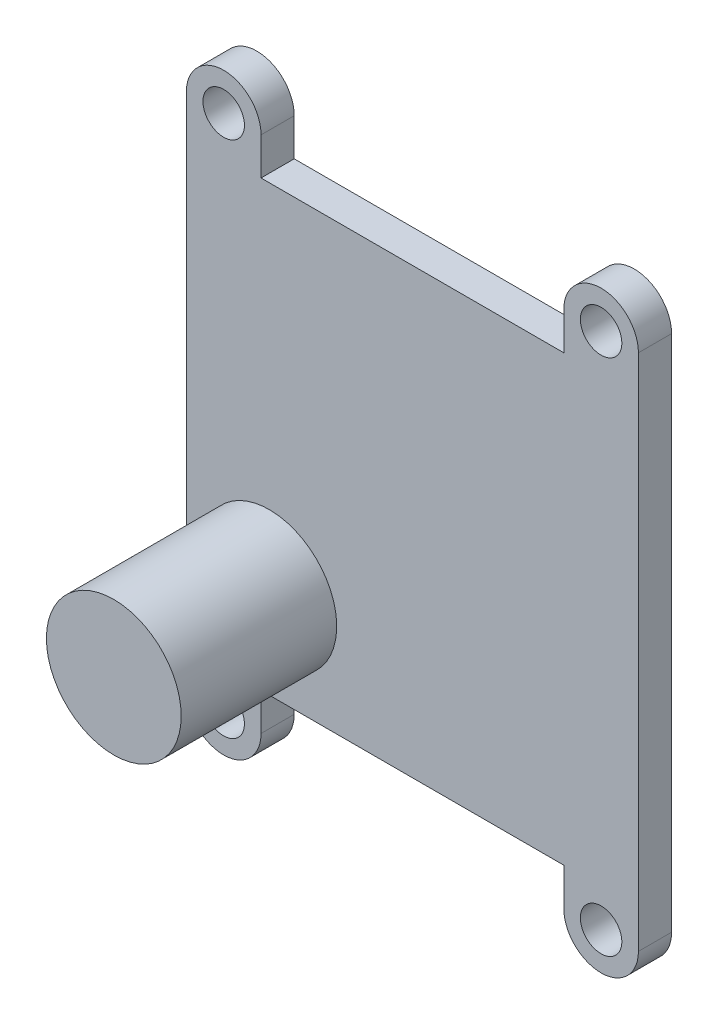
ISO-10303-21;
HEADER;
FILE_DESCRIPTION(('STEP AP214'),'2;1');
FILE_NAME('part.step','',(''),(''),'','','');
FILE_SCHEMA(('AUTOMOTIVE_DESIGN { 1 0 10303 214 1 1 1 1 }'));
ENDSEC;
DATA;
#1=APPLICATION_CONTEXT('core data for automotive mechanical design processes');
#2=APPLICATION_PROTOCOL_DEFINITION('international standard','automotive_design',2000,#1);
#3=PRODUCT_CONTEXT('',#1,'mechanical');
#4=PRODUCT('Part','Part','',(#3));
#5=PRODUCT_RELATED_PRODUCT_CATEGORY('part','',(#4));
#6=PRODUCT_DEFINITION_FORMATION('','',#4);
#7=PRODUCT_DEFINITION_CONTEXT('part definition',#1,'design');
#8=PRODUCT_DEFINITION('design','',#6,#7);
#9=PRODUCT_DEFINITION_SHAPE('','',#8);
#10=(LENGTH_UNIT() NAMED_UNIT(*) SI_UNIT(.MILLI.,.METRE.));
#11=(NAMED_UNIT(*) PLANE_ANGLE_UNIT() SI_UNIT($,.RADIAN.));
#12=(NAMED_UNIT(*) SI_UNIT($,.STERADIAN.) SOLID_ANGLE_UNIT());
#13=UNCERTAINTY_MEASURE_WITH_UNIT(LENGTH_MEASURE(1.E-05),#10,'distance_accuracy_value','');
#14=(GEOMETRIC_REPRESENTATION_CONTEXT(3) GLOBAL_UNCERTAINTY_ASSIGNED_CONTEXT((#13)) GLOBAL_UNIT_ASSIGNED_CONTEXT((#10,
#11,#12)) REPRESENTATION_CONTEXT('',''));
#15=CARTESIAN_POINT('',(0.,0.,0.));
#16=DIRECTION('',(0.,0.,1.));
#17=DIRECTION('',(1.,0.,0.));
#18=AXIS2_PLACEMENT_3D('',#15,#16,#17);
#19=CARTESIAN_POINT('',(-9.1,-12.5,1.6));
#20=DIRECTION('',(0.,0.,-1.));
#21=DIRECTION('',(-1.,0.,0.));
#22=AXIS2_PLACEMENT_3D('',#19,#20,#21);
#23=PLANE('',#22);
#24=CARTESIAN_POINT('',(-6.9,-6.2,1.6));
#25=DIRECTION('',(0.,0.,-1.));
#26=DIRECTION('',(-1.,0.,0.));
#27=AXIS2_PLACEMENT_3D('',#24,#25,#26);
#28=CIRCLE('',#27,3.25);
#29=CARTESIAN_POINT('',(-10.15,-6.2,1.6));
#30=VERTEX_POINT('',#29);
#31=EDGE_CURVE('E11',#30,#30,#28,.F.);
#32=ORIENTED_EDGE('',*,*,#31,.F.);
#33=EDGE_LOOP('',(#32));
#34=FACE_BOUND('',#33,.T.);
#35=DIRECTION('',(0.,-1.,0.));
#36=VECTOR('',#35,1.);
#37=CARTESIAN_POINT('',(-10.9,12.5,1.6));
#38=LINE('',#37,#36);
#39=CARTESIAN_POINT('',(-10.9,12.5,1.6));
#40=VERTEX_POINT('',#39);
#41=CARTESIAN_POINT('',(-10.9,-12.5,1.6));
#42=VERTEX_POINT('',#41);
#43=EDGE_CURVE('E112',#40,#42,#38,.T.);
#44=ORIENTED_EDGE('',*,*,#43,.T.);
#45=CARTESIAN_POINT('',(-9.1,-12.5,1.6));
#46=DIRECTION('',(0.,0.,1.));
#47=DIRECTION('',(-1.,0.,0.));
#48=AXIS2_PLACEMENT_3D('',#45,#46,#47);
#49=CIRCLE('',#48,1.8);
#50=CARTESIAN_POINT('',(-7.3,-12.5,1.6));
#51=VERTEX_POINT('',#50);
#52=EDGE_CURVE('E214',#42,#51,#49,.T.);
#53=ORIENTED_EDGE('',*,*,#52,.T.);
#54=DIRECTION('',(0.,1.,0.));
#55=VECTOR('',#54,1.);
#56=CARTESIAN_POINT('',(-7.3,-12.5,1.6));
#57=LINE('',#56,#55);
#58=CARTESIAN_POINT('',(-7.3,-10.7,1.6));
#59=VERTEX_POINT('',#58);
#60=EDGE_CURVE('E232',#51,#59,#57,.T.);
#61=ORIENTED_EDGE('',*,*,#60,.T.);
#62=DIRECTION('',(1.,0.,0.));
#63=VECTOR('',#62,1.);
#64=CARTESIAN_POINT('',(-7.3,-10.7,1.6));
#65=LINE('',#64,#63);
#66=CARTESIAN_POINT('',(7.3,-10.7,1.6));
#67=VERTEX_POINT('',#66);
#68=EDGE_CURVE('E229',#59,#67,#65,.T.);
#69=ORIENTED_EDGE('',*,*,#68,.T.);
#70=DIRECTION('',(0.,-1.,0.));
#71=VECTOR('',#70,1.);
#72=CARTESIAN_POINT('',(7.3,-12.5,1.6));
#73=LINE('',#72,#71);
#74=CARTESIAN_POINT('',(7.3,-12.5,1.6));
#75=VERTEX_POINT('',#74);
#76=EDGE_CURVE('E231',#67,#75,#73,.T.);
#77=ORIENTED_EDGE('',*,*,#76,.T.);
#78=CARTESIAN_POINT('',(9.1,-12.5,1.6));
#79=DIRECTION('',(0.,0.,1.));
#80=DIRECTION('',(1.,0.,0.));
#81=AXIS2_PLACEMENT_3D('',#78,#79,#80);
#82=CIRCLE('',#81,1.8);
#83=CARTESIAN_POINT('',(10.9,-12.5,1.6));
#84=VERTEX_POINT('',#83);
#85=EDGE_CURVE('E234',#75,#84,#82,.T.);
#86=ORIENTED_EDGE('',*,*,#85,.T.);
#87=DIRECTION('',(0.,1.,0.));
#88=VECTOR('',#87,1.);
#89=CARTESIAN_POINT('',(10.9,-12.5,1.6));
#90=LINE('',#89,#88);
#91=CARTESIAN_POINT('',(10.9,12.5,1.6));
#92=VERTEX_POINT('',#91);
#93=EDGE_CURVE('E240',#84,#92,#90,.T.);
#94=ORIENTED_EDGE('',*,*,#93,.T.);
#95=CARTESIAN_POINT('',(9.1,12.5,1.6));
#96=DIRECTION('',(0.,0.,1.));
#97=DIRECTION('',(-1.,0.,0.));
#98=AXIS2_PLACEMENT_3D('',#95,#96,#97);
#99=CIRCLE('',#98,1.8);
#100=CARTESIAN_POINT('',(7.3,12.5,1.6));
#101=VERTEX_POINT('',#100);
#102=EDGE_CURVE('E242',#92,#101,#99,.T.);
#103=ORIENTED_EDGE('',*,*,#102,.T.);
#104=DIRECTION('',(0.,-1.,0.));
#105=VECTOR('',#104,1.);
#106=CARTESIAN_POINT('',(7.3,12.5,1.6));
#107=LINE('',#106,#105);
#108=CARTESIAN_POINT('',(7.3,10.7,1.6));
#109=VERTEX_POINT('',#108);
#110=EDGE_CURVE('E144',#101,#109,#107,.T.);
#111=ORIENTED_EDGE('',*,*,#110,.T.);
#112=DIRECTION('',(-1.,0.,0.));
#113=VECTOR('',#112,1.);
#114=CARTESIAN_POINT('',(-7.3,10.7,1.6));
#115=LINE('',#114,#113);
#116=CARTESIAN_POINT('',(-7.3,10.7,1.6));
#117=VERTEX_POINT('',#116);
#118=EDGE_CURVE('E138',#109,#117,#115,.T.);
#119=ORIENTED_EDGE('',*,*,#118,.T.);
#120=DIRECTION('',(0.,1.,0.));
#121=VECTOR('',#120,1.);
#122=CARTESIAN_POINT('',(-7.3,12.5,1.6));
#123=LINE('',#122,#121);
#124=CARTESIAN_POINT('',(-7.3,12.5,1.6));
#125=VERTEX_POINT('',#124);
#126=EDGE_CURVE('E142',#117,#125,#123,.T.);
#127=ORIENTED_EDGE('',*,*,#126,.T.);
#128=CARTESIAN_POINT('',(-9.1,12.5,1.6));
#129=DIRECTION('',(0.,0.,1.));
#130=DIRECTION('',(1.,0.,0.));
#131=AXIS2_PLACEMENT_3D('',#128,#129,#130);
#132=CIRCLE('',#131,1.8);
#133=EDGE_CURVE('E58',#125,#40,#132,.T.);
#134=ORIENTED_EDGE('',*,*,#133,.T.);
#135=EDGE_LOOP('',(#44,#53,#61,#69,#77,#86,#94,#103,#111,#119,#127,#134));
#136=FACE_BOUND('',#135,.T.);
#137=CARTESIAN_POINT('',(-9.1,12.5,1.6));
#138=DIRECTION('',(0.,0.,1.));
#139=DIRECTION('',(1.,0.,0.));
#140=AXIS2_PLACEMENT_3D('',#137,#138,#139);
#141=CIRCLE('',#140,1.);
#142=CARTESIAN_POINT('',(-8.1,12.5,1.6));
#143=VERTEX_POINT('',#142);
#144=EDGE_CURVE('E164',#143,#143,#141,.T.);
#145=ORIENTED_EDGE('',*,*,#144,.F.);
#146=EDGE_LOOP('',(#145));
#147=FACE_BOUND('',#146,.T.);
#148=CARTESIAN_POINT('',(9.1,12.5,1.6));
#149=DIRECTION('',(0.,0.,1.));
#150=DIRECTION('',(-1.,0.,0.));
#151=AXIS2_PLACEMENT_3D('',#148,#149,#150);
#152=CIRCLE('',#151,1.);
#153=CARTESIAN_POINT('',(8.1,12.5,1.6));
#154=VERTEX_POINT('',#153);
#155=EDGE_CURVE('E260',#154,#154,#152,.T.);
#156=ORIENTED_EDGE('',*,*,#155,.F.);
#157=EDGE_LOOP('',(#156));
#158=FACE_BOUND('',#157,.T.);
#159=CARTESIAN_POINT('',(9.1,-12.5,1.6));
#160=DIRECTION('',(0.,0.,1.));
#161=DIRECTION('',(1.,0.,0.));
#162=AXIS2_PLACEMENT_3D('',#159,#160,#161);
#163=CIRCLE('',#162,1.);
#164=CARTESIAN_POINT('',(10.1,-12.5,1.6));
#165=VERTEX_POINT('',#164);
#166=EDGE_CURVE('E266',#165,#165,#163,.T.);
#167=ORIENTED_EDGE('',*,*,#166,.F.);
#168=EDGE_LOOP('',(#167));
#169=FACE_BOUND('',#168,.T.);
#170=CARTESIAN_POINT('',(-9.1,-12.5,1.6));
#171=DIRECTION('',(0.,0.,1.));
#172=DIRECTION('',(-1.,0.,0.));
#173=AXIS2_PLACEMENT_3D('',#170,#171,#172);
#174=CIRCLE('',#173,1.);
#175=CARTESIAN_POINT('',(-10.1,-12.5,1.6));
#176=VERTEX_POINT('',#175);
#177=EDGE_CURVE('E272',#176,#176,#174,.T.);
#178=ORIENTED_EDGE('',*,*,#177,.F.);
#179=EDGE_LOOP('',(#178));
#180=FACE_BOUND('',#179,.T.);
#181=ADVANCED_FACE('F41',(#34,#136,#147,#158,#169,#180),#23,.F.);
#182=CARTESIAN_POINT('',(-9.1,-12.5,0.));
#183=DIRECTION('',(0.,0.,-1.));
#184=DIRECTION('',(-1.,0.,0.));
#185=AXIS2_PLACEMENT_3D('',#182,#183,#184);
#186=PLANE('',#185);
#187=CARTESIAN_POINT('',(9.1,-12.5,0.));
#188=DIRECTION('',(0.,0.,1.));
#189=DIRECTION('',(1.,0.,0.));
#190=AXIS2_PLACEMENT_3D('',#187,#188,#189);
#191=CIRCLE('',#190,1.);
#192=CARTESIAN_POINT('',(10.1,-12.5,0.));
#193=VERTEX_POINT('',#192);
#194=EDGE_CURVE('E269',#193,#193,#191,.T.);
#195=ORIENTED_EDGE('',*,*,#194,.T.);
#196=EDGE_LOOP('',(#195));
#197=FACE_BOUND('',#196,.T.);
#198=CARTESIAN_POINT('',(-9.1,12.5,0.));
#199=DIRECTION('',(0.,0.,1.));
#200=DIRECTION('',(1.,0.,0.));
#201=AXIS2_PLACEMENT_3D('',#198,#199,#200);
#202=CIRCLE('',#201,1.);
#203=CARTESIAN_POINT('',(-8.1,12.5,0.));
#204=VERTEX_POINT('',#203);
#205=EDGE_CURVE('E257',#204,#204,#202,.T.);
#206=ORIENTED_EDGE('',*,*,#205,.T.);
#207=EDGE_LOOP('',(#206));
#208=FACE_BOUND('',#207,.T.);
#209=DIRECTION('',(0.,-1.,0.));
#210=VECTOR('',#209,1.);
#211=CARTESIAN_POINT('',(-10.9,-12.5,0.));
#212=LINE('',#211,#210);
#213=CARTESIAN_POINT('',(-10.9,12.5,0.));
#214=VERTEX_POINT('',#213);
#215=CARTESIAN_POINT('',(-10.9,-12.5,0.));
#216=VERTEX_POINT('',#215);
#217=EDGE_CURVE('E106',#214,#216,#212,.T.);
#218=ORIENTED_EDGE('',*,*,#217,.F.);
#219=CARTESIAN_POINT('',(-9.1,12.5,0.));
#220=DIRECTION('',(0.,0.,1.));
#221=DIRECTION('',(1.,0.,0.));
#222=AXIS2_PLACEMENT_3D('',#219,#220,#221);
#223=CIRCLE('',#222,1.8);
#224=CARTESIAN_POINT('',(-7.3,12.5,0.));
#225=VERTEX_POINT('',#224);
#226=EDGE_CURVE('E183',#225,#214,#223,.T.);
#227=ORIENTED_EDGE('',*,*,#226,.F.);
#228=DIRECTION('',(0.,1.,0.));
#229=VECTOR('',#228,1.);
#230=CARTESIAN_POINT('',(-7.3,12.5,0.));
#231=LINE('',#230,#229);
#232=CARTESIAN_POINT('',(-7.3,10.7,0.));
#233=VERTEX_POINT('',#232);
#234=EDGE_CURVE('E99',#233,#225,#231,.T.);
#235=ORIENTED_EDGE('',*,*,#234,.F.);
#236=DIRECTION('',(-1.,0.,0.));
#237=VECTOR('',#236,1.);
#238=CARTESIAN_POINT('',(-7.3,10.7,0.));
#239=LINE('',#238,#237);
#240=CARTESIAN_POINT('',(7.3,10.7,0.));
#241=VERTEX_POINT('',#240);
#242=EDGE_CURVE('E152',#241,#233,#239,.T.);
#243=ORIENTED_EDGE('',*,*,#242,.F.);
#244=DIRECTION('',(0.,-1.,0.));
#245=VECTOR('',#244,1.);
#246=CARTESIAN_POINT('',(7.3,12.5,0.));
#247=LINE('',#246,#245);
#248=CARTESIAN_POINT('',(7.3,12.5,0.));
#249=VERTEX_POINT('',#248);
#250=EDGE_CURVE('E179',#249,#241,#247,.T.);
#251=ORIENTED_EDGE('',*,*,#250,.F.);
#252=CARTESIAN_POINT('',(9.1,12.5,0.));
#253=DIRECTION('',(0.,0.,1.));
#254=DIRECTION('',(-1.,0.,0.));
#255=AXIS2_PLACEMENT_3D('',#252,#253,#254);
#256=CIRCLE('',#255,1.8);
#257=CARTESIAN_POINT('',(10.9,12.5,0.));
#258=VERTEX_POINT('',#257);
#259=EDGE_CURVE('E177',#258,#249,#256,.T.);
#260=ORIENTED_EDGE('',*,*,#259,.F.);
#261=DIRECTION('',(0.,1.,0.));
#262=VECTOR('',#261,1.);
#263=CARTESIAN_POINT('',(10.9,12.5,0.));
#264=LINE('',#263,#262);
#265=CARTESIAN_POINT('',(10.9,-12.5,0.));
#266=VERTEX_POINT('',#265);
#267=EDGE_CURVE('E175',#266,#258,#264,.T.);
#268=ORIENTED_EDGE('',*,*,#267,.F.);
#269=CARTESIAN_POINT('',(9.1,-12.5,0.));
#270=DIRECTION('',(0.,0.,1.));
#271=DIRECTION('',(1.,0.,0.));
#272=AXIS2_PLACEMENT_3D('',#269,#270,#271);
#273=CIRCLE('',#272,1.8);
#274=CARTESIAN_POINT('',(7.3,-12.5,0.));
#275=VERTEX_POINT('',#274);
#276=EDGE_CURVE('E172',#275,#266,#273,.T.);
#277=ORIENTED_EDGE('',*,*,#276,.F.);
#278=DIRECTION('',(0.,-1.,0.));
#279=VECTOR('',#278,1.);
#280=CARTESIAN_POINT('',(7.3,-12.5,0.));
#281=LINE('',#280,#279);
#282=CARTESIAN_POINT('',(7.3,-10.7,0.));
#283=VERTEX_POINT('',#282);
#284=EDGE_CURVE('E170',#283,#275,#281,.T.);
#285=ORIENTED_EDGE('',*,*,#284,.F.);
#286=DIRECTION('',(1.,0.,0.));
#287=VECTOR('',#286,1.);
#288=CARTESIAN_POINT('',(-7.3,-10.7,0.));
#289=LINE('',#288,#287);
#290=CARTESIAN_POINT('',(-7.3,-10.7,0.));
#291=VERTEX_POINT('',#290);
#292=EDGE_CURVE('E168',#291,#283,#289,.T.);
#293=ORIENTED_EDGE('',*,*,#292,.F.);
#294=DIRECTION('',(0.,1.,0.));
#295=VECTOR('',#294,1.);
#296=CARTESIAN_POINT('',(-7.3,-12.5,0.));
#297=LINE('',#296,#295);
#298=CARTESIAN_POINT('',(-7.3,-12.5,0.));
#299=VERTEX_POINT('',#298);
#300=EDGE_CURVE('E166',#299,#291,#297,.T.);
#301=ORIENTED_EDGE('',*,*,#300,.F.);
#302=CARTESIAN_POINT('',(-9.1,-12.5,0.));
#303=DIRECTION('',(0.,0.,1.));
#304=DIRECTION('',(-1.,0.,0.));
#305=AXIS2_PLACEMENT_3D('',#302,#303,#304);
#306=CIRCLE('',#305,1.8);
#307=EDGE_CURVE('E163',#216,#299,#306,.T.);
#308=ORIENTED_EDGE('',*,*,#307,.F.);
#309=EDGE_LOOP('',(#218,#227,#235,#243,#251,#260,#268,#277,#285,#293,#301,#308));
#310=FACE_BOUND('',#309,.T.);
#311=CARTESIAN_POINT('',(9.1,12.5,0.));
#312=DIRECTION('',(0.,0.,1.));
#313=DIRECTION('',(-1.,0.,0.));
#314=AXIS2_PLACEMENT_3D('',#311,#312,#313);
#315=CIRCLE('',#314,1.);
#316=CARTESIAN_POINT('',(8.1,12.5,0.));
#317=VERTEX_POINT('',#316);
#318=EDGE_CURVE('E263',#317,#317,#315,.T.);
#319=ORIENTED_EDGE('',*,*,#318,.T.);
#320=EDGE_LOOP('',(#319));
#321=FACE_BOUND('',#320,.T.);
#322=CARTESIAN_POINT('',(-9.1,-12.5,0.));
#323=DIRECTION('',(0.,0.,1.));
#324=DIRECTION('',(-1.,0.,0.));
#325=AXIS2_PLACEMENT_3D('',#322,#323,#324);
#326=CIRCLE('',#325,1.);
#327=CARTESIAN_POINT('',(-10.1,-12.5,0.));
#328=VERTEX_POINT('',#327);
#329=EDGE_CURVE('E275',#328,#328,#326,.T.);
#330=ORIENTED_EDGE('',*,*,#329,.T.);
#331=EDGE_LOOP('',(#330));
#332=FACE_BOUND('',#331,.T.);
#333=ADVANCED_FACE('F217',(#197,#208,#310,#321,#332),#186,.T.);
#334=CARTESIAN_POINT('',(-10.9,-12.5,1.6));
#335=DIRECTION('',(1.,0.,0.));
#336=DIRECTION('',(0.,1.,0.));
#337=AXIS2_PLACEMENT_3D('',#334,#335,#336);
#338=PLANE('',#337);
#339=ORIENTED_EDGE('',*,*,#217,.T.);
#340=DIRECTION('',(0.,0.,-1.));
#341=VECTOR('',#340,1.);
#342=CARTESIAN_POINT('',(-10.9,-12.5,1.6));
#343=LINE('',#342,#341);
#344=EDGE_CURVE('E50',#42,#216,#343,.T.);
#345=ORIENTED_EDGE('',*,*,#344,.F.);
#346=ORIENTED_EDGE('',*,*,#43,.F.);
#347=DIRECTION('',(0.,0.,-1.));
#348=VECTOR('',#347,1.);
#349=CARTESIAN_POINT('',(-10.9,12.5,1.6));
#350=LINE('',#349,#348);
#351=EDGE_CURVE('E158',#40,#214,#350,.T.);
#352=ORIENTED_EDGE('',*,*,#351,.T.);
#353=EDGE_LOOP('',(#339,#345,#346,#352));
#354=FACE_BOUND('',#353,.T.);
#355=ADVANCED_FACE('F43',(#354),#338,.F.);
#356=CARTESIAN_POINT('',(-9.1,-12.5,1.6));
#357=DIRECTION('',(0.,0.,-1.));
#358=DIRECTION('',(-1.,0.,0.));
#359=AXIS2_PLACEMENT_3D('',#356,#357,#358);
#360=CYLINDRICAL_SURFACE('',#359,1.8);
#361=ORIENTED_EDGE('',*,*,#307,.T.);
#362=DIRECTION('',(0.,0.,-1.));
#363=VECTOR('',#362,1.);
#364=CARTESIAN_POINT('',(-7.3,-12.5,1.6));
#365=LINE('',#364,#363);
#366=EDGE_CURVE('E207',#51,#299,#365,.T.);
#367=ORIENTED_EDGE('',*,*,#366,.F.);
#368=ORIENTED_EDGE('',*,*,#52,.F.);
#369=ORIENTED_EDGE('',*,*,#344,.T.);
#370=EDGE_LOOP('',(#361,#367,#368,#369));
#371=FACE_BOUND('',#370,.T.);
#372=ADVANCED_FACE('F212',(#371),#360,.T.);
#373=CARTESIAN_POINT('',(-7.3,-12.5,1.6));
#374=DIRECTION('',(-1.,0.,0.));
#375=DIRECTION('',(0.,-1.,0.));
#376=AXIS2_PLACEMENT_3D('',#373,#374,#375);
#377=PLANE('',#376);
#378=ORIENTED_EDGE('',*,*,#300,.T.);
#379=DIRECTION('',(0.,0.,-1.));
#380=VECTOR('',#379,1.);
#381=CARTESIAN_POINT('',(-7.3,-10.7,1.6));
#382=LINE('',#381,#380);
#383=EDGE_CURVE('E204',#59,#291,#382,.T.);
#384=ORIENTED_EDGE('',*,*,#383,.F.);
#385=ORIENTED_EDGE('',*,*,#60,.F.);
#386=ORIENTED_EDGE('',*,*,#366,.T.);
#387=EDGE_LOOP('',(#378,#384,#385,#386));
#388=FACE_BOUND('',#387,.T.);
#389=ADVANCED_FACE('F223',(#388),#377,.F.);
#390=CARTESIAN_POINT('',(-7.3,-10.7,1.6));
#391=DIRECTION('',(0.,1.,0.));
#392=DIRECTION('',(-1.,0.,0.));
#393=AXIS2_PLACEMENT_3D('',#390,#391,#392);
#394=PLANE('',#393);
#395=ORIENTED_EDGE('',*,*,#292,.T.);
#396=DIRECTION('',(0.,0.,-1.));
#397=VECTOR('',#396,1.);
#398=CARTESIAN_POINT('',(7.3,-10.7,1.6));
#399=LINE('',#398,#397);
#400=EDGE_CURVE('E201',#67,#283,#399,.T.);
#401=ORIENTED_EDGE('',*,*,#400,.F.);
#402=ORIENTED_EDGE('',*,*,#68,.F.);
#403=ORIENTED_EDGE('',*,*,#383,.T.);
#404=EDGE_LOOP('',(#395,#401,#402,#403));
#405=FACE_BOUND('',#404,.T.);
#406=ADVANCED_FACE('F227',(#405),#394,.F.);
#407=CARTESIAN_POINT('',(7.3,-12.5,1.6));
#408=DIRECTION('',(1.,0.,0.));
#409=DIRECTION('',(0.,0.,-1.));
#410=AXIS2_PLACEMENT_3D('',#407,#408,#409);
#411=PLANE('',#410);
#412=ORIENTED_EDGE('',*,*,#284,.T.);
#413=DIRECTION('',(0.,0.,-1.));
#414=VECTOR('',#413,1.);
#415=CARTESIAN_POINT('',(7.3,-12.5,1.6));
#416=LINE('',#415,#414);
#417=EDGE_CURVE('E198',#75,#275,#416,.T.);
#418=ORIENTED_EDGE('',*,*,#417,.F.);
#419=ORIENTED_EDGE('',*,*,#76,.F.);
#420=ORIENTED_EDGE('',*,*,#400,.T.);
#421=EDGE_LOOP('',(#412,#418,#419,#420));
#422=FACE_BOUND('',#421,.T.);
#423=ADVANCED_FACE('F322',(#422),#411,.F.);
#424=CARTESIAN_POINT('',(9.1,-12.5,1.6));
#425=DIRECTION('',(0.,0.,-1.));
#426=DIRECTION('',(-1.,0.,0.));
#427=AXIS2_PLACEMENT_3D('',#424,#425,#426);
#428=CYLINDRICAL_SURFACE('',#427,1.8);
#429=ORIENTED_EDGE('',*,*,#276,.T.);
#430=DIRECTION('',(0.,0.,-1.));
#431=VECTOR('',#430,1.);
#432=CARTESIAN_POINT('',(10.9,-12.5,1.6));
#433=LINE('',#432,#431);
#434=EDGE_CURVE('E195',#84,#266,#433,.T.);
#435=ORIENTED_EDGE('',*,*,#434,.F.);
#436=ORIENTED_EDGE('',*,*,#85,.F.);
#437=ORIENTED_EDGE('',*,*,#417,.T.);
#438=EDGE_LOOP('',(#429,#435,#436,#437));
#439=FACE_BOUND('',#438,.T.);
#440=ADVANCED_FACE('F318',(#439),#428,.T.);
#441=CARTESIAN_POINT('',(10.9,12.5,1.6));
#442=DIRECTION('',(-1.,0.,0.));
#443=DIRECTION('',(0.,-1.,0.));
#444=AXIS2_PLACEMENT_3D('',#441,#442,#443);
#445=PLANE('',#444);
#446=ORIENTED_EDGE('',*,*,#267,.T.);
#447=DIRECTION('',(0.,0.,-1.));
#448=VECTOR('',#447,1.);
#449=CARTESIAN_POINT('',(10.9,12.5,1.6));
#450=LINE('',#449,#448);
#451=EDGE_CURVE('E192',#92,#258,#450,.T.);
#452=ORIENTED_EDGE('',*,*,#451,.F.);
#453=ORIENTED_EDGE('',*,*,#93,.F.);
#454=ORIENTED_EDGE('',*,*,#434,.T.);
#455=EDGE_LOOP('',(#446,#452,#453,#454));
#456=FACE_BOUND('',#455,.T.);
#457=ADVANCED_FACE('F315',(#456),#445,.F.);
#458=CARTESIAN_POINT('',(9.1,12.5,1.6));
#459=DIRECTION('',(0.,0.,-1.));
#460=DIRECTION('',(-1.,0.,0.));
#461=AXIS2_PLACEMENT_3D('',#458,#459,#460);
#462=CYLINDRICAL_SURFACE('',#461,1.8);
#463=ORIENTED_EDGE('',*,*,#259,.T.);
#464=DIRECTION('',(0.,0.,-1.));
#465=VECTOR('',#464,1.);
#466=CARTESIAN_POINT('',(7.3,12.5,1.6));
#467=LINE('',#466,#465);
#468=EDGE_CURVE('E189',#101,#249,#467,.T.);
#469=ORIENTED_EDGE('',*,*,#468,.F.);
#470=ORIENTED_EDGE('',*,*,#102,.F.);
#471=ORIENTED_EDGE('',*,*,#451,.T.);
#472=EDGE_LOOP('',(#463,#469,#470,#471));
#473=FACE_BOUND('',#472,.T.);
#474=ADVANCED_FACE('F248',(#473),#462,.T.);
#475=CARTESIAN_POINT('',(7.3,12.5,1.6));
#476=DIRECTION('',(1.,0.,0.));
#477=DIRECTION('',(0.,0.,-1.));
#478=AXIS2_PLACEMENT_3D('',#475,#476,#477);
#479=PLANE('',#478);
#480=ORIENTED_EDGE('',*,*,#250,.T.);
#481=DIRECTION('',(0.,0.,-1.));
#482=VECTOR('',#481,1.);
#483=CARTESIAN_POINT('',(7.3,10.7,1.6));
#484=LINE('',#483,#482);
#485=EDGE_CURVE('E153',#109,#241,#484,.T.);
#486=ORIENTED_EDGE('',*,*,#485,.F.);
#487=ORIENTED_EDGE('',*,*,#110,.F.);
#488=ORIENTED_EDGE('',*,*,#468,.T.);
#489=EDGE_LOOP('',(#480,#486,#487,#488));
#490=FACE_BOUND('',#489,.T.);
#491=ADVANCED_FACE('F252',(#490),#479,.F.);
#492=CARTESIAN_POINT('',(-7.3,10.7,1.6));
#493=DIRECTION('',(0.,-1.,0.));
#494=DIRECTION('',(0.,0.,-1.));
#495=AXIS2_PLACEMENT_3D('',#492,#493,#494);
#496=PLANE('',#495);
#497=ORIENTED_EDGE('',*,*,#242,.T.);
#498=DIRECTION('',(0.,0.,-1.));
#499=VECTOR('',#498,1.);
#500=CARTESIAN_POINT('',(-7.3,10.7,1.6));
#501=LINE('',#500,#499);
#502=EDGE_CURVE('E149',#117,#233,#501,.T.);
#503=ORIENTED_EDGE('',*,*,#502,.F.);
#504=ORIENTED_EDGE('',*,*,#118,.F.);
#505=ORIENTED_EDGE('',*,*,#485,.T.);
#506=EDGE_LOOP('',(#497,#503,#504,#505));
#507=FACE_BOUND('',#506,.T.);
#508=ADVANCED_FACE('F150',(#507),#496,.F.);
#509=CARTESIAN_POINT('',(-7.3,12.5,1.6));
#510=DIRECTION('',(-1.,0.,0.));
#511=DIRECTION('',(0.,0.,1.));
#512=AXIS2_PLACEMENT_3D('',#509,#510,#511);
#513=PLANE('',#512);
#514=ORIENTED_EDGE('',*,*,#234,.T.);
#515=DIRECTION('',(0.,0.,-1.));
#516=VECTOR('',#515,1.);
#517=CARTESIAN_POINT('',(-7.3,12.5,1.6));
#518=LINE('',#517,#516);
#519=EDGE_CURVE('E154',#125,#225,#518,.T.);
#520=ORIENTED_EDGE('',*,*,#519,.F.);
#521=ORIENTED_EDGE('',*,*,#126,.F.);
#522=ORIENTED_EDGE('',*,*,#502,.T.);
#523=EDGE_LOOP('',(#514,#520,#521,#522));
#524=FACE_BOUND('',#523,.T.);
#525=ADVANCED_FACE('F156',(#524),#513,.F.);
#526=CARTESIAN_POINT('',(-9.1,12.5,1.6));
#527=DIRECTION('',(0.,0.,-1.));
#528=DIRECTION('',(-1.,0.,0.));
#529=AXIS2_PLACEMENT_3D('',#526,#527,#528);
#530=CYLINDRICAL_SURFACE('',#529,1.8);
#531=ORIENTED_EDGE('',*,*,#226,.T.);
#532=ORIENTED_EDGE('',*,*,#351,.F.);
#533=ORIENTED_EDGE('',*,*,#133,.F.);
#534=ORIENTED_EDGE('',*,*,#519,.T.);
#535=EDGE_LOOP('',(#531,#532,#533,#534));
#536=FACE_BOUND('',#535,.T.);
#537=ADVANCED_FACE('F254',(#536),#530,.T.);
#538=CARTESIAN_POINT('',(-9.1,12.5,1.6));
#539=DIRECTION('',(0.,0.,-1.));
#540=DIRECTION('',(-1.,0.,0.));
#541=AXIS2_PLACEMENT_3D('',#538,#539,#540);
#542=CYLINDRICAL_SURFACE('',#541,1.);
#543=ORIENTED_EDGE('',*,*,#144,.T.);
#544=EDGE_LOOP('',(#543));
#545=FACE_BOUND('',#544,.T.);
#546=ORIENTED_EDGE('',*,*,#205,.F.);
#547=EDGE_LOOP('',(#546));
#548=FACE_BOUND('',#547,.T.);
#549=ADVANCED_FACE('F302',(#545,#548),#542,.F.);
#550=CARTESIAN_POINT('',(9.1,12.5,1.6));
#551=DIRECTION('',(0.,0.,-1.));
#552=DIRECTION('',(-1.,0.,0.));
#553=AXIS2_PLACEMENT_3D('',#550,#551,#552);
#554=CYLINDRICAL_SURFACE('',#553,1.);
#555=ORIENTED_EDGE('',*,*,#155,.T.);
#556=EDGE_LOOP('',(#555));
#557=FACE_BOUND('',#556,.T.);
#558=ORIENTED_EDGE('',*,*,#318,.F.);
#559=EDGE_LOOP('',(#558));
#560=FACE_BOUND('',#559,.T.);
#561=ADVANCED_FACE('F416',(#557,#560),#554,.F.);
#562=CARTESIAN_POINT('',(9.1,-12.5,1.6));
#563=DIRECTION('',(0.,0.,-1.));
#564=DIRECTION('',(-1.,0.,0.));
#565=AXIS2_PLACEMENT_3D('',#562,#563,#564);
#566=CYLINDRICAL_SURFACE('',#565,1.);
#567=ORIENTED_EDGE('',*,*,#166,.T.);
#568=EDGE_LOOP('',(#567));
#569=FACE_BOUND('',#568,.T.);
#570=ORIENTED_EDGE('',*,*,#194,.F.);
#571=EDGE_LOOP('',(#570));
#572=FACE_BOUND('',#571,.T.);
#573=ADVANCED_FACE('F424',(#569,#572),#566,.F.);
#574=CARTESIAN_POINT('',(-9.1,-12.5,1.6));
#575=DIRECTION('',(0.,0.,-1.));
#576=DIRECTION('',(-1.,0.,0.));
#577=AXIS2_PLACEMENT_3D('',#574,#575,#576);
#578=CYLINDRICAL_SURFACE('',#577,1.);
#579=ORIENTED_EDGE('',*,*,#177,.T.);
#580=EDGE_LOOP('',(#579));
#581=FACE_BOUND('',#580,.T.);
#582=ORIENTED_EDGE('',*,*,#329,.F.);
#583=EDGE_LOOP('',(#582));
#584=FACE_BOUND('',#583,.T.);
#585=ADVANCED_FACE('F289',(#581,#584),#578,.F.);
#586=CARTESIAN_POINT('',(-6.9,-6.2,9.1));
#587=DIRECTION('',(0.,0.,-1.));
#588=DIRECTION('',(-1.,0.,0.));
#589=AXIS2_PLACEMENT_3D('',#586,#587,#588);
#590=CYLINDRICAL_SURFACE('',#589,3.25);
#591=CARTESIAN_POINT('',(-6.9,-6.2,9.1));
#592=DIRECTION('',(0.,0.,1.));
#593=DIRECTION('',(1.,0.,0.));
#594=AXIS2_PLACEMENT_3D('',#591,#592,#593);
#595=CIRCLE('',#594,3.25);
#596=CARTESIAN_POINT('',(-3.65,-6.2,9.1));
#597=VERTEX_POINT('',#596);
#598=EDGE_CURVE('E278',#597,#597,#595,.T.);
#599=ORIENTED_EDGE('',*,*,#598,.F.);
#600=EDGE_LOOP('',(#599));
#601=FACE_BOUND('',#600,.T.);
#602=ORIENTED_EDGE('',*,*,#31,.T.);
#603=EDGE_LOOP('',(#602));
#604=FACE_BOUND('',#603,.T.);
#605=ADVANCED_FACE('F286',(#601,#604),#590,.T.);
#606=CARTESIAN_POINT('',(-6.9,-6.2,9.1));
#607=DIRECTION('',(0.,0.,1.));
#608=DIRECTION('',(1.,0.,0.));
#609=AXIS2_PLACEMENT_3D('',#606,#607,#608);
#610=PLANE('',#609);
#611=ORIENTED_EDGE('',*,*,#598,.T.);
#612=EDGE_LOOP('',(#611));
#613=FACE_BOUND('',#612,.T.);
#614=ADVANCED_FACE('F284',(#613),#610,.T.);
#615=CLOSED_SHELL('',(#181,#333,#355,#372,#389,#406,#423,#440,#457,#474,#491,#508,#525,#537,
#549,#561,#573,#585,#605,#614));
#616=MANIFOLD_SOLID_BREP('B2',#615);
#617=ADVANCED_BREP_SHAPE_REPRESENTATION('',(#18,#616),#14);
#618=SHAPE_DEFINITION_REPRESENTATION(#9,#617);
ENDSEC;
END-ISO-10303-21;
